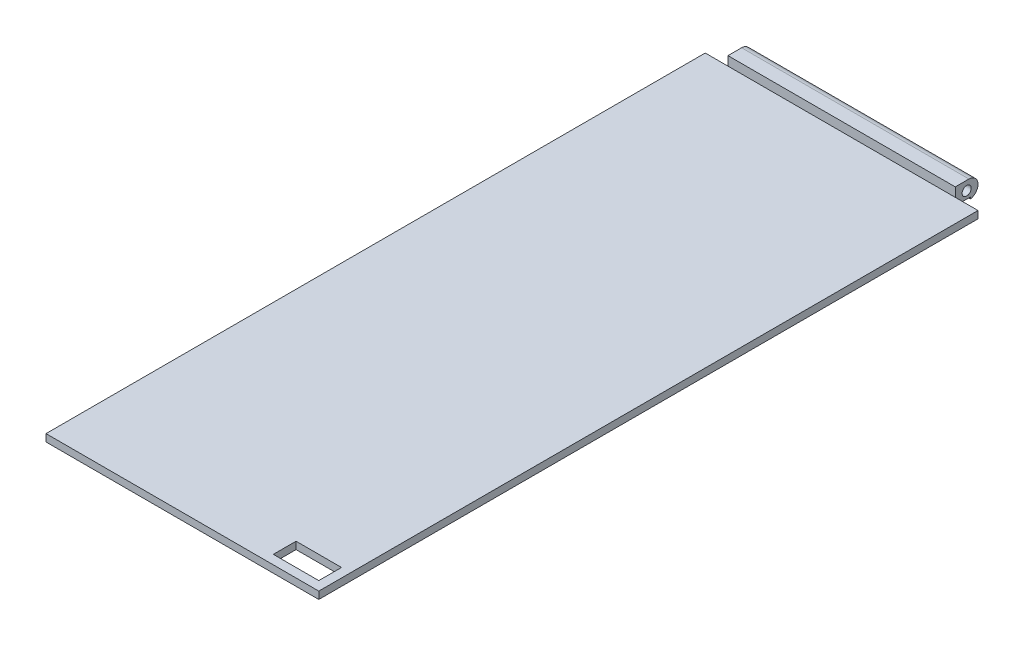
ISO-10303-21;
HEADER;
FILE_DESCRIPTION(('STEP AP214'),'2;1');
FILE_NAME('part.step','',(''),(''),'','','');
FILE_SCHEMA(('AUTOMOTIVE_DESIGN { 1 0 10303 214 1 1 1 1 }'));
ENDSEC;
DATA;
#1=APPLICATION_CONTEXT('core data for automotive mechanical design processes');
#2=APPLICATION_PROTOCOL_DEFINITION('international standard','automotive_design',2000,#1);
#3=PRODUCT_CONTEXT('',#1,'mechanical');
#4=PRODUCT('Part','Part','',(#3));
#5=PRODUCT_RELATED_PRODUCT_CATEGORY('part','',(#4));
#6=PRODUCT_DEFINITION_FORMATION('','',#4);
#7=PRODUCT_DEFINITION_CONTEXT('part definition',#1,'design');
#8=PRODUCT_DEFINITION('design','',#6,#7);
#9=PRODUCT_DEFINITION_SHAPE('','',#8);
#10=(LENGTH_UNIT() NAMED_UNIT(*) SI_UNIT(.MILLI.,.METRE.));
#11=(NAMED_UNIT(*) PLANE_ANGLE_UNIT() SI_UNIT($,.RADIAN.));
#12=(NAMED_UNIT(*) SI_UNIT($,.STERADIAN.) SOLID_ANGLE_UNIT());
#13=UNCERTAINTY_MEASURE_WITH_UNIT(LENGTH_MEASURE(1.E-05),#10,'distance_accuracy_value','');
#14=(GEOMETRIC_REPRESENTATION_CONTEXT(3) GLOBAL_UNCERTAINTY_ASSIGNED_CONTEXT((#13)) GLOBAL_UNIT_ASSIGNED_CONTEXT((#10,
#11,#12)) REPRESENTATION_CONTEXT('',''));
#15=CARTESIAN_POINT('',(0.,0.,0.));
#16=DIRECTION('',(0.,0.,1.));
#17=DIRECTION('',(1.,0.,0.));
#18=AXIS2_PLACEMENT_3D('',#15,#16,#17);
#19=CARTESIAN_POINT('',(15.,1.,35.));
#20=DIRECTION('',(-1.,0.,0.));
#21=DIRECTION('',(0.,0.,1.));
#22=AXIS2_PLACEMENT_3D('',#19,#20,#21);
#23=PLANE('',#22);
#24=DIRECTION('',(0.,0.,1.));
#25=VECTOR('',#24,1.);
#26=CARTESIAN_POINT('',(15.,0.2,40.));
#27=LINE('',#26,#25);
#28=CARTESIAN_POINT('',(15.,0.2,-32.5));
#29=VERTEX_POINT('',#28);
#30=CARTESIAN_POINT('',(15.,0.2,40.));
#31=VERTEX_POINT('',#30);
#32=EDGE_CURVE('E152',#29,#31,#27,.T.);
#33=ORIENTED_EDGE('',*,*,#32,.F.);
#34=DIRECTION('',(0.,-1.,0.));
#35=VECTOR('',#34,1.);
#36=CARTESIAN_POINT('',(15.,2.,-32.5));
#37=LINE('',#36,#35);
#38=CARTESIAN_POINT('',(15.,1.,-32.5));
#39=VERTEX_POINT('',#38);
#40=EDGE_CURVE('E191',#39,#29,#37,.T.);
#41=ORIENTED_EDGE('',*,*,#40,.F.);
#42=DIRECTION('',(0.,0.,-1.));
#43=VECTOR('',#42,1.);
#44=CARTESIAN_POINT('',(15.,1.,35.));
#45=LINE('',#44,#43);
#46=CARTESIAN_POINT('',(15.,1.,40.));
#47=VERTEX_POINT('',#46);
#48=EDGE_CURVE('E178',#47,#39,#45,.T.);
#49=ORIENTED_EDGE('',*,*,#48,.F.);
#50=DIRECTION('',(0.,1.,0.));
#51=VECTOR('',#50,1.);
#52=CARTESIAN_POINT('',(15.,1.,40.));
#53=LINE('',#52,#51);
#54=EDGE_CURVE('E170',#31,#47,#53,.T.);
#55=ORIENTED_EDGE('',*,*,#54,.F.);
#56=EDGE_LOOP('',(#33,#41,#49,#55));
#57=FACE_BOUND('',#56,.T.);
#58=ADVANCED_FACE('F45',(#57),#23,.F.);
#59=CARTESIAN_POINT('',(-15.,1.,35.));
#60=DIRECTION('',(-1.,0.,0.));
#61=DIRECTION('',(0.,0.,1.));
#62=AXIS2_PLACEMENT_3D('',#59,#60,#61);
#63=PLANE('',#62);
#64=DIRECTION('',(0.,1.,0.));
#65=VECTOR('',#64,1.);
#66=CARTESIAN_POINT('',(-15.,2.,-32.5));
#67=LINE('',#66,#65);
#68=CARTESIAN_POINT('',(-15.,0.2,-32.5));
#69=VERTEX_POINT('',#68);
#70=CARTESIAN_POINT('',(-15.,1.,-32.5));
#71=VERTEX_POINT('',#70);
#72=EDGE_CURVE('E195',#69,#71,#67,.T.);
#73=ORIENTED_EDGE('',*,*,#72,.F.);
#74=DIRECTION('',(0.,0.,-1.));
#75=VECTOR('',#74,1.);
#76=CARTESIAN_POINT('',(-15.,0.2,40.));
#77=LINE('',#76,#75);
#78=CARTESIAN_POINT('',(-15.,0.2,40.));
#79=VERTEX_POINT('',#78);
#80=EDGE_CURVE('E325',#79,#69,#77,.T.);
#81=ORIENTED_EDGE('',*,*,#80,.F.);
#82=DIRECTION('',(0.,-1.,0.));
#83=VECTOR('',#82,1.);
#84=CARTESIAN_POINT('',(-15.,1.,40.));
#85=LINE('',#84,#83);
#86=CARTESIAN_POINT('',(-15.,1.,40.));
#87=VERTEX_POINT('',#86);
#88=EDGE_CURVE('E173',#87,#79,#85,.T.);
#89=ORIENTED_EDGE('',*,*,#88,.F.);
#90=DIRECTION('',(0.,0.,-1.));
#91=VECTOR('',#90,1.);
#92=CARTESIAN_POINT('',(-15.,1.,35.));
#93=LINE('',#92,#91);
#94=EDGE_CURVE('E229',#87,#71,#93,.T.);
#95=ORIENTED_EDGE('',*,*,#94,.T.);
#96=EDGE_LOOP('',(#73,#81,#89,#95));
#97=FACE_BOUND('',#96,.T.);
#98=ADVANCED_FACE('F336',(#97),#63,.T.);
#99=CARTESIAN_POINT('',(0.,0.,-32.5));
#100=DIRECTION('',(0.,0.,1.));
#101=DIRECTION('',(1.,0.,0.));
#102=AXIS2_PLACEMENT_3D('',#99,#100,#101);
#103=PLANE('',#102);
#104=DIRECTION('',(1.,0.,0.));
#105=VECTOR('',#104,1.);
#106=CARTESIAN_POINT('',(0.,0.2,-32.5));
#107=LINE('',#106,#105);
#108=CARTESIAN_POINT('',(-12.5,0.2,-32.5));
#109=VERTEX_POINT('',#108);
#110=EDGE_CURVE('E310',#69,#109,#107,.T.);
#111=ORIENTED_EDGE('',*,*,#110,.F.);
#112=ORIENTED_EDGE('',*,*,#72,.T.);
#113=DIRECTION('',(1.,0.,0.));
#114=VECTOR('',#113,1.);
#115=CARTESIAN_POINT('',(-15.,1.,-32.5));
#116=LINE('',#115,#114);
#117=CARTESIAN_POINT('',(-12.5,1.,-32.5));
#118=VERTEX_POINT('',#117);
#119=EDGE_CURVE('E224',#71,#118,#116,.T.);
#120=ORIENTED_EDGE('',*,*,#119,.T.);
#121=DIRECTION('',(0.,-1.,0.));
#122=VECTOR('',#121,1.);
#123=CARTESIAN_POINT('',(-12.5,2.,-32.5));
#124=LINE('',#123,#122);
#125=EDGE_CURVE('E207',#118,#109,#124,.T.);
#126=ORIENTED_EDGE('',*,*,#125,.T.);
#127=EDGE_LOOP('',(#111,#112,#120,#126));
#128=FACE_BOUND('',#127,.T.);
#129=ADVANCED_FACE('F333',(#128),#103,.F.);
#130=CARTESIAN_POINT('',(0.,0.,-32.5));
#131=DIRECTION('',(0.,0.,-1.));
#132=DIRECTION('',(-1.,0.,0.));
#133=AXIS2_PLACEMENT_3D('',#130,#131,#132);
#134=PLANE('',#133);
#135=ORIENTED_EDGE('',*,*,#40,.T.);
#136=DIRECTION('',(-1.,0.,0.));
#137=VECTOR('',#136,1.);
#138=CARTESIAN_POINT('',(0.,0.2,-32.5));
#139=LINE('',#138,#137);
#140=CARTESIAN_POINT('',(12.5,0.2,-32.5));
#141=VERTEX_POINT('',#140);
#142=EDGE_CURVE('E158',#29,#141,#139,.T.);
#143=ORIENTED_EDGE('',*,*,#142,.T.);
#144=DIRECTION('',(0.,1.,0.));
#145=VECTOR('',#144,1.);
#146=CARTESIAN_POINT('',(12.5,2.,-32.5));
#147=LINE('',#146,#145);
#148=CARTESIAN_POINT('',(12.5,1.,-32.5));
#149=VERTEX_POINT('',#148);
#150=EDGE_CURVE('E196',#141,#149,#147,.T.);
#151=ORIENTED_EDGE('',*,*,#150,.T.);
#152=DIRECTION('',(-1.,0.,0.));
#153=VECTOR('',#152,1.);
#154=CARTESIAN_POINT('',(0.,1.,-32.5));
#155=LINE('',#154,#153);
#156=EDGE_CURVE('E214',#39,#149,#155,.T.);
#157=ORIENTED_EDGE('',*,*,#156,.F.);
#158=EDGE_LOOP('',(#135,#143,#151,#157));
#159=FACE_BOUND('',#158,.T.);
#160=ADVANCED_FACE('F368',(#159),#134,.T.);
#161=CARTESIAN_POINT('',(0.,0.,40.));
#162=DIRECTION('',(0.,0.,1.));
#163=DIRECTION('',(1.,0.,0.));
#164=AXIS2_PLACEMENT_3D('',#161,#162,#163);
#165=PLANE('',#164);
#166=ORIENTED_EDGE('',*,*,#88,.T.);
#167=DIRECTION('',(-1.,0.,0.));
#168=VECTOR('',#167,1.);
#169=CARTESIAN_POINT('',(-15.,0.2,40.));
#170=LINE('',#169,#168);
#171=EDGE_CURVE('E155',#31,#79,#170,.T.);
#172=ORIENTED_EDGE('',*,*,#171,.F.);
#173=ORIENTED_EDGE('',*,*,#54,.T.);
#174=DIRECTION('',(-1.,0.,0.));
#175=VECTOR('',#174,1.);
#176=CARTESIAN_POINT('',(-15.,1.,40.));
#177=LINE('',#176,#175);
#178=EDGE_CURVE('E181',#47,#87,#177,.T.);
#179=ORIENTED_EDGE('',*,*,#178,.T.);
#180=EDGE_LOOP('',(#166,#172,#173,#179));
#181=FACE_BOUND('',#180,.T.);
#182=ADVANCED_FACE('F168',(#181),#165,.T.);
#183=CARTESIAN_POINT('',(9.,0.,36.5));
#184=DIRECTION('',(-1.,0.,0.));
#185=DIRECTION('',(0.,0.,1.));
#186=AXIS2_PLACEMENT_3D('',#183,#184,#185);
#187=PLANE('',#186);
#188=DIRECTION('',(0.,0.,1.));
#189=VECTOR('',#188,1.);
#190=CARTESIAN_POINT('',(9.,0.2,36.5));
#191=LINE('',#190,#189);
#192=CARTESIAN_POINT('',(9.,0.2,36.5));
#193=VERTEX_POINT('',#192);
#194=CARTESIAN_POINT('',(9.,0.2,39.));
#195=VERTEX_POINT('',#194);
#196=EDGE_CURVE('E68',#193,#195,#191,.T.);
#197=ORIENTED_EDGE('',*,*,#196,.F.);
#198=DIRECTION('',(0.,1.,0.));
#199=VECTOR('',#198,1.);
#200=CARTESIAN_POINT('',(9.,0.,36.5));
#201=LINE('',#200,#199);
#202=CARTESIAN_POINT('',(9.,1.,36.5));
#203=VERTEX_POINT('',#202);
#204=EDGE_CURVE('E187',#193,#203,#201,.T.);
#205=ORIENTED_EDGE('',*,*,#204,.T.);
#206=DIRECTION('',(0.,0.,1.));
#207=VECTOR('',#206,1.);
#208=CARTESIAN_POINT('',(9.,1.,36.5));
#209=LINE('',#208,#207);
#210=CARTESIAN_POINT('',(9.,1.,39.));
#211=VERTEX_POINT('',#210);
#212=EDGE_CURVE('E297',#203,#211,#209,.T.);
#213=ORIENTED_EDGE('',*,*,#212,.T.);
#214=DIRECTION('',(0.,1.,0.));
#215=VECTOR('',#214,1.);
#216=CARTESIAN_POINT('',(9.,0.,39.));
#217=LINE('',#216,#215);
#218=EDGE_CURVE('E280',#195,#211,#217,.T.);
#219=ORIENTED_EDGE('',*,*,#218,.F.);
#220=EDGE_LOOP('',(#197,#205,#213,#219));
#221=FACE_BOUND('',#220,.T.);
#222=ADVANCED_FACE('F377',(#221),#187,.F.);
#223=CARTESIAN_POINT('',(9.,0.,36.5));
#224=DIRECTION('',(0.,0.,-1.));
#225=DIRECTION('',(-1.,0.,0.));
#226=AXIS2_PLACEMENT_3D('',#223,#224,#225);
#227=PLANE('',#226);
#228=DIRECTION('',(-1.,0.,0.));
#229=VECTOR('',#228,1.);
#230=CARTESIAN_POINT('',(9.,0.2,36.5));
#231=LINE('',#230,#229);
#232=CARTESIAN_POINT('',(14.,0.2,36.5));
#233=VERTEX_POINT('',#232);
#234=EDGE_CURVE('E273',#233,#193,#231,.T.);
#235=ORIENTED_EDGE('',*,*,#234,.F.);
#236=DIRECTION('',(0.,1.,0.));
#237=VECTOR('',#236,1.);
#238=CARTESIAN_POINT('',(14.,0.,36.5));
#239=LINE('',#238,#237);
#240=CARTESIAN_POINT('',(14.,1.,36.5));
#241=VERTEX_POINT('',#240);
#242=EDGE_CURVE('E271',#233,#241,#239,.T.);
#243=ORIENTED_EDGE('',*,*,#242,.T.);
#244=DIRECTION('',(-1.,0.,0.));
#245=VECTOR('',#244,1.);
#246=CARTESIAN_POINT('',(9.,1.,36.5));
#247=LINE('',#246,#245);
#248=EDGE_CURVE('E285',#241,#203,#247,.T.);
#249=ORIENTED_EDGE('',*,*,#248,.T.);
#250=ORIENTED_EDGE('',*,*,#204,.F.);
#251=EDGE_LOOP('',(#235,#243,#249,#250));
#252=FACE_BOUND('',#251,.T.);
#253=ADVANCED_FACE('F416',(#252),#227,.F.);
#254=CARTESIAN_POINT('',(14.,0.,36.5));
#255=DIRECTION('',(1.,0.,0.));
#256=DIRECTION('',(0.,0.,-1.));
#257=AXIS2_PLACEMENT_3D('',#254,#255,#256);
#258=PLANE('',#257);
#259=DIRECTION('',(0.,0.,-1.));
#260=VECTOR('',#259,1.);
#261=CARTESIAN_POINT('',(14.,0.2,36.5));
#262=LINE('',#261,#260);
#263=CARTESIAN_POINT('',(14.,0.2,39.));
#264=VERTEX_POINT('',#263);
#265=EDGE_CURVE('E175',#264,#233,#262,.T.);
#266=ORIENTED_EDGE('',*,*,#265,.F.);
#267=DIRECTION('',(0.,1.,0.));
#268=VECTOR('',#267,1.);
#269=CARTESIAN_POINT('',(14.,0.,39.));
#270=LINE('',#269,#268);
#271=CARTESIAN_POINT('',(14.,1.,39.));
#272=VERTEX_POINT('',#271);
#273=EDGE_CURVE('E269',#264,#272,#270,.T.);
#274=ORIENTED_EDGE('',*,*,#273,.T.);
#275=DIRECTION('',(0.,0.,-1.));
#276=VECTOR('',#275,1.);
#277=CARTESIAN_POINT('',(14.,1.,36.5));
#278=LINE('',#277,#276);
#279=EDGE_CURVE('E292',#272,#241,#278,.T.);
#280=ORIENTED_EDGE('',*,*,#279,.T.);
#281=ORIENTED_EDGE('',*,*,#242,.F.);
#282=EDGE_LOOP('',(#266,#274,#280,#281));
#283=FACE_BOUND('',#282,.T.);
#284=ADVANCED_FACE('F267',(#283),#258,.F.);
#285=CARTESIAN_POINT('',(9.,0.,39.));
#286=DIRECTION('',(0.,0.,1.));
#287=DIRECTION('',(1.,0.,0.));
#288=AXIS2_PLACEMENT_3D('',#285,#286,#287);
#289=PLANE('',#288);
#290=DIRECTION('',(1.,0.,0.));
#291=VECTOR('',#290,1.);
#292=CARTESIAN_POINT('',(9.,0.2,39.));
#293=LINE('',#292,#291);
#294=EDGE_CURVE('E54',#195,#264,#293,.T.);
#295=ORIENTED_EDGE('',*,*,#294,.F.);
#296=ORIENTED_EDGE('',*,*,#218,.T.);
#297=DIRECTION('',(1.,0.,0.));
#298=VECTOR('',#297,1.);
#299=CARTESIAN_POINT('',(9.,1.,39.));
#300=LINE('',#299,#298);
#301=EDGE_CURVE('E277',#211,#272,#300,.T.);
#302=ORIENTED_EDGE('',*,*,#301,.T.);
#303=ORIENTED_EDGE('',*,*,#273,.F.);
#304=EDGE_LOOP('',(#295,#296,#302,#303));
#305=FACE_BOUND('',#304,.T.);
#306=ADVANCED_FACE('F275',(#305),#289,.F.);
#307=CARTESIAN_POINT('',(0.,1.,0.));
#308=DIRECTION('',(0.,1.,0.));
#309=DIRECTION('',(0.,0.,1.));
#310=AXIS2_PLACEMENT_3D('',#307,#308,#309);
#311=PLANE('',#310);
#312=ORIENTED_EDGE('',*,*,#212,.F.);
#313=ORIENTED_EDGE('',*,*,#248,.F.);
#314=ORIENTED_EDGE('',*,*,#279,.F.);
#315=ORIENTED_EDGE('',*,*,#301,.F.);
#316=EDGE_LOOP('',(#312,#313,#314,#315));
#317=FACE_BOUND('',#316,.T.);
#318=ORIENTED_EDGE('',*,*,#119,.F.);
#319=ORIENTED_EDGE('',*,*,#94,.F.);
#320=ORIENTED_EDGE('',*,*,#178,.F.);
#321=ORIENTED_EDGE('',*,*,#48,.T.);
#322=ORIENTED_EDGE('',*,*,#156,.T.);
#323=EDGE_CURVE('E218',#118,#149,#116,.T.);
#324=ORIENTED_EDGE('',*,*,#323,.F.);
#325=EDGE_LOOP('',(#318,#319,#320,#321,#322,#324));
#326=FACE_BOUND('',#325,.T.);
#327=ADVANCED_FACE('F338',(#317,#326),#311,.T.);
#328=CARTESIAN_POINT('',(-15.,2.,-32.5));
#329=DIRECTION('',(0.,0.,-1.));
#330=DIRECTION('',(-1.,0.,0.));
#331=AXIS2_PLACEMENT_3D('',#328,#329,#330);
#332=PLANE('',#331);
#333=ORIENTED_EDGE('',*,*,#323,.T.);
#334=CARTESIAN_POINT('',(12.5,2.,-32.5));
#335=VERTEX_POINT('',#334);
#336=EDGE_CURVE('E194',#149,#335,#147,.T.);
#337=ORIENTED_EDGE('',*,*,#336,.T.);
#338=DIRECTION('',(1.,0.,0.));
#339=VECTOR('',#338,1.);
#340=CARTESIAN_POINT('',(-15.,2.,-32.5));
#341=LINE('',#340,#339);
#342=CARTESIAN_POINT('',(-12.5,2.,-32.5));
#343=VERTEX_POINT('',#342);
#344=EDGE_CURVE('E220',#343,#335,#341,.T.);
#345=ORIENTED_EDGE('',*,*,#344,.F.);
#346=EDGE_CURVE('E208',#343,#118,#124,.T.);
#347=ORIENTED_EDGE('',*,*,#346,.T.);
#348=EDGE_LOOP('',(#333,#337,#345,#347));
#349=FACE_BOUND('',#348,.T.);
#350=ADVANCED_FACE('F348',(#349),#332,.F.);
#351=CARTESIAN_POINT('',(0.,2.,0.));
#352=DIRECTION('',(0.,1.,0.));
#353=DIRECTION('',(0.,0.,1.));
#354=AXIS2_PLACEMENT_3D('',#351,#352,#353);
#355=PLANE('',#354);
#356=DIRECTION('',(0.,0.,-1.));
#357=VECTOR('',#356,1.);
#358=CARTESIAN_POINT('',(12.5,2.,-32.5));
#359=LINE('',#358,#357);
#360=CARTESIAN_POINT('',(12.5,2.,-34.));
#361=VERTEX_POINT('',#360);
#362=EDGE_CURVE('E199',#335,#361,#359,.T.);
#363=ORIENTED_EDGE('',*,*,#362,.T.);
#364=DIRECTION('',(-1.,0.,0.));
#365=VECTOR('',#364,1.);
#366=CARTESIAN_POINT('',(0.,2.,-34.));
#367=LINE('',#366,#365);
#368=CARTESIAN_POINT('',(-12.5,2.,-34.));
#369=VERTEX_POINT('',#368);
#370=EDGE_CURVE('E233',#361,#369,#367,.T.);
#371=ORIENTED_EDGE('',*,*,#370,.T.);
#372=DIRECTION('',(0.,0.,-1.));
#373=VECTOR('',#372,1.);
#374=CARTESIAN_POINT('',(-12.5,2.,-32.5));
#375=LINE('',#374,#373);
#376=EDGE_CURVE('E185',#343,#369,#375,.T.);
#377=ORIENTED_EDGE('',*,*,#376,.F.);
#378=ORIENTED_EDGE('',*,*,#344,.T.);
#379=EDGE_LOOP('',(#363,#371,#377,#378));
#380=FACE_BOUND('',#379,.T.);
#381=ADVANCED_FACE('F352',(#380),#355,.T.);
#382=CARTESIAN_POINT('',(-12.5,2.,-32.5));
#383=DIRECTION('',(1.,0.,0.));
#384=DIRECTION('',(0.,0.,-1.));
#385=AXIS2_PLACEMENT_3D('',#382,#383,#384);
#386=PLANE('',#385);
#387=CARTESIAN_POINT('',(-12.5,1.,-34.));
#388=DIRECTION('',(1.,0.,0.));
#389=DIRECTION('',(0.,0.,-1.));
#390=AXIS2_PLACEMENT_3D('',#387,#388,#389);
#391=CIRCLE('',#390,1.);
#392=CARTESIAN_POINT('',(-12.5,1.,-35.));
#393=VERTEX_POINT('',#392);
#394=CARTESIAN_POINT('',(-12.5,0.0125946534059813,-34.1582108767359));
#395=VERTEX_POINT('',#394);
#396=EDGE_CURVE('E256',#393,#395,#391,.F.);
#397=ORIENTED_EDGE('',*,*,#396,.T.);
#398=DIRECTION('',(0.,1.,0.));
#399=VECTOR('',#398,1.);
#400=CARTESIAN_POINT('',(-12.5,2.,-34.1582108767359));
#401=LINE('',#400,#399);
#402=CARTESIAN_POINT('',(-12.5,0.2,-34.1582108767359));
#403=VERTEX_POINT('',#402);
#404=EDGE_CURVE('E60',#395,#403,#401,.T.);
#405=ORIENTED_EDGE('',*,*,#404,.T.);
#406=DIRECTION('',(0.,0.,-1.));
#407=VECTOR('',#406,1.);
#408=CARTESIAN_POINT('',(-12.5,0.2,-32.5));
#409=LINE('',#408,#407);
#410=EDGE_CURVE('E307',#109,#403,#409,.T.);
#411=ORIENTED_EDGE('',*,*,#410,.F.);
#412=ORIENTED_EDGE('',*,*,#125,.F.);
#413=ORIENTED_EDGE('',*,*,#346,.F.);
#414=ORIENTED_EDGE('',*,*,#376,.T.);
#415=CARTESIAN_POINT('',(-12.5,1.,-34.));
#416=DIRECTION('',(1.,0.,0.));
#417=DIRECTION('',(0.,0.,-1.));
#418=AXIS2_PLACEMENT_3D('',#415,#416,#417);
#419=CIRCLE('',#418,1.);
#420=EDGE_CURVE('E243',#369,#393,#419,.F.);
#421=ORIENTED_EDGE('',*,*,#420,.T.);
#422=EDGE_LOOP('',(#397,#405,#411,#412,#413,#414,#421));
#423=FACE_BOUND('',#422,.T.);
#424=CARTESIAN_POINT('',(-12.5,1.,-33.75));
#425=DIRECTION('',(1.,0.,0.));
#426=DIRECTION('',(0.,0.,-1.));
#427=AXIS2_PLACEMENT_3D('',#424,#425,#426);
#428=CIRCLE('',#427,0.499999999999999);
#429=CARTESIAN_POINT('',(-12.5,1.,-34.25));
#430=VERTEX_POINT('',#429);
#431=EDGE_CURVE('E203',#430,#430,#428,.F.);
#432=ORIENTED_EDGE('',*,*,#431,.F.);
#433=EDGE_LOOP('',(#432));
#434=FACE_BOUND('',#433,.T.);
#435=ADVANCED_FACE('F342',(#423,#434),#386,.F.);
#436=CARTESIAN_POINT('',(12.5,2.,-32.5));
#437=DIRECTION('',(-1.,0.,0.));
#438=DIRECTION('',(0.,0.,1.));
#439=AXIS2_PLACEMENT_3D('',#436,#437,#438);
#440=PLANE('',#439);
#441=DIRECTION('',(0.,0.,1.));
#442=VECTOR('',#441,1.);
#443=CARTESIAN_POINT('',(12.5,0.2,-32.5));
#444=LINE('',#443,#442);
#445=CARTESIAN_POINT('',(12.5,0.2,-34.1582108767359));
#446=VERTEX_POINT('',#445);
#447=EDGE_CURVE('E313',#446,#141,#444,.T.);
#448=ORIENTED_EDGE('',*,*,#447,.F.);
#449=DIRECTION('',(0.,-1.,0.));
#450=VECTOR('',#449,1.);
#451=CARTESIAN_POINT('',(12.5,2.,-34.1582108767359));
#452=LINE('',#451,#450);
#453=CARTESIAN_POINT('',(12.5,0.0125946534059816,-34.1582108767359));
#454=VERTEX_POINT('',#453);
#455=EDGE_CURVE('E303',#446,#454,#452,.T.);
#456=ORIENTED_EDGE('',*,*,#455,.T.);
#457=CARTESIAN_POINT('',(12.5,1.,-34.));
#458=DIRECTION('',(-1.,0.,0.));
#459=DIRECTION('',(0.,0.,1.));
#460=AXIS2_PLACEMENT_3D('',#457,#458,#459);
#461=CIRCLE('',#460,1.);
#462=CARTESIAN_POINT('',(12.5,1.,-35.));
#463=VERTEX_POINT('',#462);
#464=EDGE_CURVE('E253',#454,#463,#461,.F.);
#465=ORIENTED_EDGE('',*,*,#464,.T.);
#466=CARTESIAN_POINT('',(12.5,1.,-34.));
#467=DIRECTION('',(-1.,0.,0.));
#468=DIRECTION('',(0.,0.,1.));
#469=AXIS2_PLACEMENT_3D('',#466,#467,#468);
#470=CIRCLE('',#469,1.);
#471=EDGE_CURVE('E250',#463,#361,#470,.F.);
#472=ORIENTED_EDGE('',*,*,#471,.T.);
#473=ORIENTED_EDGE('',*,*,#362,.F.);
#474=ORIENTED_EDGE('',*,*,#336,.F.);
#475=ORIENTED_EDGE('',*,*,#150,.F.);
#476=EDGE_LOOP('',(#448,#456,#465,#472,#473,#474,#475));
#477=FACE_BOUND('',#476,.T.);
#478=CARTESIAN_POINT('',(12.5,1.,-33.75));
#479=DIRECTION('',(-1.,0.,0.));
#480=DIRECTION('',(0.,0.,1.));
#481=AXIS2_PLACEMENT_3D('',#478,#479,#480);
#482=CIRCLE('',#481,0.499999999999999);
#483=CARTESIAN_POINT('',(12.5,1.,-33.25));
#484=VERTEX_POINT('',#483);
#485=EDGE_CURVE('E219',#484,#484,#482,.F.);
#486=ORIENTED_EDGE('',*,*,#485,.F.);
#487=EDGE_LOOP('',(#486));
#488=FACE_BOUND('',#487,.T.);
#489=ADVANCED_FACE('F364',(#477,#488),#440,.F.);
#490=CARTESIAN_POINT('',(-15.,1.,-33.75));
#491=DIRECTION('',(1.,0.,0.));
#492=DIRECTION('',(0.,0.,-1.));
#493=AXIS2_PLACEMENT_3D('',#490,#491,#492);
#494=CYLINDRICAL_SURFACE('',#493,0.499999999999999);
#495=ORIENTED_EDGE('',*,*,#485,.T.);
#496=EDGE_LOOP('',(#495));
#497=FACE_BOUND('',#496,.T.);
#498=ORIENTED_EDGE('',*,*,#431,.T.);
#499=EDGE_LOOP('',(#498));
#500=FACE_BOUND('',#499,.T.);
#501=ADVANCED_FACE('F390',(#497,#500),#494,.F.);
#502=CARTESIAN_POINT('',(0.,1.,-34.));
#503=DIRECTION('',(-1.,0.,0.));
#504=DIRECTION('',(0.,0.,1.));
#505=AXIS2_PLACEMENT_3D('',#502,#503,#504);
#506=CYLINDRICAL_SURFACE('',#505,1.);
#507=ORIENTED_EDGE('',*,*,#471,.F.);
#508=DIRECTION('',(-1.,0.,0.));
#509=VECTOR('',#508,1.);
#510=CARTESIAN_POINT('',(-15.,1.,-35.));
#511=LINE('',#510,#509);
#512=EDGE_CURVE('E246',#393,#463,#511,.F.);
#513=ORIENTED_EDGE('',*,*,#512,.F.);
#514=ORIENTED_EDGE('',*,*,#420,.F.);
#515=ORIENTED_EDGE('',*,*,#370,.F.);
#516=EDGE_LOOP('',(#507,#513,#514,#515));
#517=FACE_BOUND('',#516,.T.);
#518=ADVANCED_FACE('F358',(#517),#506,.T.);
#519=CARTESIAN_POINT('',(0.,1.,-34.));
#520=DIRECTION('',(-1.,0.,0.));
#521=DIRECTION('',(0.,0.,1.));
#522=AXIS2_PLACEMENT_3D('',#519,#520,#521);
#523=CYLINDRICAL_SURFACE('',#522,1.);
#524=DIRECTION('',(-1.,0.,0.));
#525=VECTOR('',#524,1.);
#526=CARTESIAN_POINT('',(0.,0.0125946534059816,-34.1582108767359));
#527=LINE('',#526,#525);
#528=EDGE_CURVE('E11',#395,#454,#527,.F.);
#529=ORIENTED_EDGE('',*,*,#528,.F.);
#530=ORIENTED_EDGE('',*,*,#396,.F.);
#531=ORIENTED_EDGE('',*,*,#512,.T.);
#532=ORIENTED_EDGE('',*,*,#464,.F.);
#533=EDGE_LOOP('',(#529,#530,#531,#532));
#534=FACE_BOUND('',#533,.T.);
#535=ADVANCED_FACE('F47',(#534),#523,.T.);
#536=CARTESIAN_POINT('',(-15.,0.2,-34.1582108767359));
#537=DIRECTION('',(0.,0.,-1.));
#538=DIRECTION('',(-1.,0.,0.));
#539=AXIS2_PLACEMENT_3D('',#536,#537,#538);
#540=PLANE('',#539);
#541=ORIENTED_EDGE('',*,*,#528,.T.);
#542=ORIENTED_EDGE('',*,*,#455,.F.);
#543=DIRECTION('',(1.,0.,0.));
#544=VECTOR('',#543,1.);
#545=CARTESIAN_POINT('',(-15.,0.2,-34.1582108767359));
#546=LINE('',#545,#544);
#547=EDGE_CURVE('E164',#403,#446,#546,.T.);
#548=ORIENTED_EDGE('',*,*,#547,.F.);
#549=ORIENTED_EDGE('',*,*,#404,.F.);
#550=EDGE_LOOP('',(#541,#542,#548,#549));
#551=FACE_BOUND('',#550,.T.);
#552=ADVANCED_FACE('F361',(#551),#540,.F.);
#553=CARTESIAN_POINT('',(0.,0.2,0.));
#554=DIRECTION('',(0.,-1.,0.));
#555=DIRECTION('',(0.,0.,-1.));
#556=AXIS2_PLACEMENT_3D('',#553,#554,#555);
#557=PLANE('',#556);
#558=ORIENTED_EDGE('',*,*,#196,.T.);
#559=ORIENTED_EDGE('',*,*,#294,.T.);
#560=ORIENTED_EDGE('',*,*,#265,.T.);
#561=ORIENTED_EDGE('',*,*,#234,.T.);
#562=EDGE_LOOP('',(#558,#559,#560,#561));
#563=FACE_BOUND('',#562,.T.);
#564=ORIENTED_EDGE('',*,*,#410,.T.);
#565=ORIENTED_EDGE('',*,*,#547,.T.);
#566=ORIENTED_EDGE('',*,*,#447,.T.);
#567=ORIENTED_EDGE('',*,*,#142,.F.);
#568=ORIENTED_EDGE('',*,*,#32,.T.);
#569=ORIENTED_EDGE('',*,*,#171,.T.);
#570=ORIENTED_EDGE('',*,*,#80,.T.);
#571=ORIENTED_EDGE('',*,*,#110,.T.);
#572=EDGE_LOOP('',(#564,#565,#566,#567,#568,#569,#570,#571));
#573=FACE_BOUND('',#572,.T.);
#574=ADVANCED_FACE('F154',(#563,#573),#557,.T.);
#575=CLOSED_SHELL('',(#58,#98,#129,#160,#182,#222,#253,#284,#306,#327,#350,#381,#435,#489,#501,
#518,#535,#552,#574));
#576=MANIFOLD_SOLID_BREP('B2',#575);
#577=ADVANCED_BREP_SHAPE_REPRESENTATION('',(#18,#576),#14);
#578=SHAPE_DEFINITION_REPRESENTATION(#9,#577);
ENDSEC;
END-ISO-10303-21;
